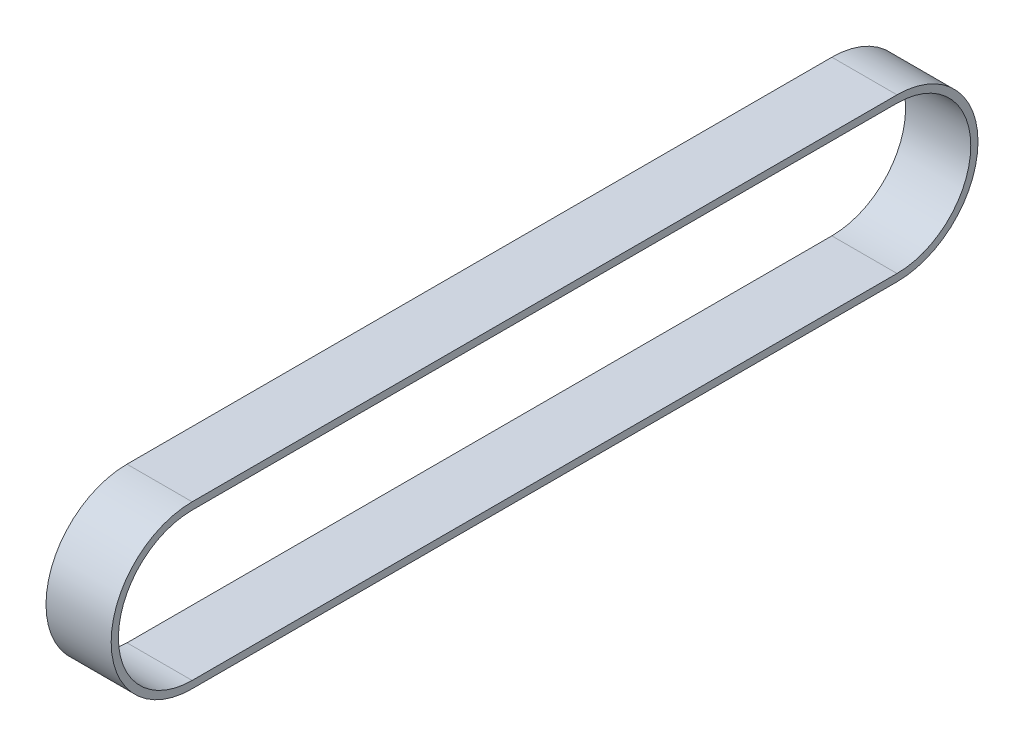
ISO-10303-21;
HEADER;
FILE_DESCRIPTION(('STEP AP214'),'2;1');
FILE_NAME('part.step','',(''),(''),'','','');
FILE_SCHEMA(('AUTOMOTIVE_DESIGN { 1 0 10303 214 1 1 1 1 }'));
ENDSEC;
DATA;
#1=APPLICATION_CONTEXT('core data for automotive mechanical design processes');
#2=APPLICATION_PROTOCOL_DEFINITION('international standard','automotive_design',2000,#1);
#3=PRODUCT_CONTEXT('',#1,'mechanical');
#4=PRODUCT('Part','Part','',(#3));
#5=PRODUCT_RELATED_PRODUCT_CATEGORY('part','',(#4));
#6=PRODUCT_DEFINITION_FORMATION('','',#4);
#7=PRODUCT_DEFINITION_CONTEXT('part definition',#1,'design');
#8=PRODUCT_DEFINITION('design','',#6,#7);
#9=PRODUCT_DEFINITION_SHAPE('','',#8);
#10=(LENGTH_UNIT() NAMED_UNIT(*) SI_UNIT(.MILLI.,.METRE.));
#11=(NAMED_UNIT(*) PLANE_ANGLE_UNIT() SI_UNIT($,.RADIAN.));
#12=(NAMED_UNIT(*) SI_UNIT($,.STERADIAN.) SOLID_ANGLE_UNIT());
#13=UNCERTAINTY_MEASURE_WITH_UNIT(LENGTH_MEASURE(1.E-05),#10,'distance_accuracy_value','');
#14=(GEOMETRIC_REPRESENTATION_CONTEXT(3) GLOBAL_UNCERTAINTY_ASSIGNED_CONTEXT((#13)) GLOBAL_UNIT_ASSIGNED_CONTEXT((#10,
#11,#12)) REPRESENTATION_CONTEXT('',''));
#15=CARTESIAN_POINT('',(0.,0.,0.));
#16=DIRECTION('',(0.,0.,1.));
#17=DIRECTION('',(1.,0.,0.));
#18=AXIS2_PLACEMENT_3D('',#15,#16,#17);
#19=CARTESIAN_POINT('',(4.5,0.,97.36128617));
#20=DIRECTION('',(1.,0.,0.));
#21=DIRECTION('',(0.,0.,-1.));
#22=AXIS2_PLACEMENT_3D('',#19,#20,#21);
#23=PLANE('',#22);
#24=CARTESIAN_POINT('',(4.5,0.,97.36128617));
#25=DIRECTION('',(1.,0.,0.));
#26=DIRECTION('',(0.,0.,-1.));
#27=AXIS2_PLACEMENT_3D('',#24,#25,#26);
#28=CIRCLE('',#27,11.185);
#29=CARTESIAN_POINT('',(4.5,11.185,97.36128617));
#30=VERTEX_POINT('',#29);
#31=CARTESIAN_POINT('',(4.5,-11.185,97.36128617));
#32=VERTEX_POINT('',#31);
#33=EDGE_CURVE('E168',#30,#32,#28,.T.);
#34=ORIENTED_EDGE('',*,*,#33,.T.);
#35=DIRECTION('',(0.,0.,-1.));
#36=VECTOR('',#35,1.);
#37=CARTESIAN_POINT('',(4.5,-11.185,0.));
#38=LINE('',#37,#36);
#39=CARTESIAN_POINT('',(4.5,-11.185,0.));
#40=VERTEX_POINT('',#39);
#41=EDGE_CURVE('E171',#32,#40,#38,.T.);
#42=ORIENTED_EDGE('',*,*,#41,.T.);
#43=CARTESIAN_POINT('',(4.5,0.,0.));
#44=DIRECTION('',(1.,0.,0.));
#45=DIRECTION('',(0.,0.,-1.));
#46=AXIS2_PLACEMENT_3D('',#43,#44,#45);
#47=CIRCLE('',#46,11.185);
#48=CARTESIAN_POINT('',(4.5,11.185,0.));
#49=VERTEX_POINT('',#48);
#50=EDGE_CURVE('E174',#40,#49,#47,.T.);
#51=ORIENTED_EDGE('',*,*,#50,.T.);
#52=DIRECTION('',(0.,0.,1.));
#53=VECTOR('',#52,1.);
#54=CARTESIAN_POINT('',(4.5,11.185,97.36128617));
#55=LINE('',#54,#53);
#56=EDGE_CURVE('E176',#49,#30,#55,.T.);
#57=ORIENTED_EDGE('',*,*,#56,.T.);
#58=EDGE_LOOP('',(#34,#42,#51,#57));
#59=FACE_BOUND('',#58,.T.);
#60=DIRECTION('',(0.,0.,-1.));
#61=VECTOR('',#60,1.);
#62=CARTESIAN_POINT('',(4.5,-10.185,0.));
#63=LINE('',#62,#61);
#64=CARTESIAN_POINT('',(4.5,-10.185,97.36128617));
#65=VERTEX_POINT('',#64);
#66=CARTESIAN_POINT('',(4.5,-10.185,0.));
#67=VERTEX_POINT('',#66);
#68=EDGE_CURVE('E140',#65,#67,#63,.T.);
#69=ORIENTED_EDGE('',*,*,#68,.F.);
#70=CARTESIAN_POINT('',(4.5,0.,97.36128617));
#71=DIRECTION('',(1.,0.,0.));
#72=DIRECTION('',(0.,0.,-1.));
#73=AXIS2_PLACEMENT_3D('',#70,#71,#72);
#74=CIRCLE('',#73,10.185);
#75=CARTESIAN_POINT('',(4.5,10.185,97.36128617));
#76=VERTEX_POINT('',#75);
#77=EDGE_CURVE('E132',#76,#65,#74,.T.);
#78=ORIENTED_EDGE('',*,*,#77,.F.);
#79=DIRECTION('',(0.,0.,1.));
#80=VECTOR('',#79,1.);
#81=CARTESIAN_POINT('',(4.5,10.185,97.36128617));
#82=LINE('',#81,#80);
#83=CARTESIAN_POINT('',(4.5,10.185,0.));
#84=VERTEX_POINT('',#83);
#85=EDGE_CURVE('E154',#84,#76,#82,.T.);
#86=ORIENTED_EDGE('',*,*,#85,.F.);
#87=CARTESIAN_POINT('',(4.5,0.,0.));
#88=DIRECTION('',(1.,0.,0.));
#89=DIRECTION('',(0.,0.,-1.));
#90=AXIS2_PLACEMENT_3D('',#87,#88,#89);
#91=CIRCLE('',#90,10.185);
#92=EDGE_CURVE('E152',#67,#84,#91,.T.);
#93=ORIENTED_EDGE('',*,*,#92,.F.);
#94=EDGE_LOOP('',(#69,#78,#86,#93));
#95=FACE_BOUND('',#94,.T.);
#96=ADVANCED_FACE('F67',(#59,#95),#23,.T.);
#97=CARTESIAN_POINT('',(-4.5,0.,97.36128617));
#98=DIRECTION('',(1.,0.,0.));
#99=DIRECTION('',(0.,0.,-1.));
#100=AXIS2_PLACEMENT_3D('',#97,#98,#99);
#101=PLANE('',#100);
#102=CARTESIAN_POINT('',(-4.5,0.,97.36128617));
#103=DIRECTION('',(1.,0.,0.));
#104=DIRECTION('',(0.,0.,-1.));
#105=AXIS2_PLACEMENT_3D('',#102,#103,#104);
#106=CIRCLE('',#105,11.185);
#107=CARTESIAN_POINT('',(-4.5,11.185,97.36128617));
#108=VERTEX_POINT('',#107);
#109=CARTESIAN_POINT('',(-4.5,-11.185,97.36128617));
#110=VERTEX_POINT('',#109);
#111=EDGE_CURVE('E148',#108,#110,#106,.T.);
#112=ORIENTED_EDGE('',*,*,#111,.F.);
#113=DIRECTION('',(0.,0.,1.));
#114=VECTOR('',#113,1.);
#115=CARTESIAN_POINT('',(-4.5,11.185,97.36128617));
#116=LINE('',#115,#114);
#117=CARTESIAN_POINT('',(-4.5,11.185,0.));
#118=VERTEX_POINT('',#117);
#119=EDGE_CURVE('E172',#118,#108,#116,.T.);
#120=ORIENTED_EDGE('',*,*,#119,.F.);
#121=CARTESIAN_POINT('',(-4.5,0.,0.));
#122=DIRECTION('',(1.,0.,0.));
#123=DIRECTION('',(0.,0.,-1.));
#124=AXIS2_PLACEMENT_3D('',#121,#122,#123);
#125=CIRCLE('',#124,11.185);
#126=CARTESIAN_POINT('',(-4.5,-11.185,0.));
#127=VERTEX_POINT('',#126);
#128=EDGE_CURVE('E183',#127,#118,#125,.T.);
#129=ORIENTED_EDGE('',*,*,#128,.F.);
#130=DIRECTION('',(0.,0.,-1.));
#131=VECTOR('',#130,1.);
#132=CARTESIAN_POINT('',(-4.5,-11.185,0.));
#133=LINE('',#132,#131);
#134=EDGE_CURVE('E181',#110,#127,#133,.T.);
#135=ORIENTED_EDGE('',*,*,#134,.F.);
#136=EDGE_LOOP('',(#112,#120,#129,#135));
#137=FACE_BOUND('',#136,.T.);
#138=CARTESIAN_POINT('',(-4.5,0.,97.36128617));
#139=DIRECTION('',(1.,0.,0.));
#140=DIRECTION('',(0.,0.,-1.));
#141=AXIS2_PLACEMENT_3D('',#138,#139,#140);
#142=CIRCLE('',#141,10.185);
#143=CARTESIAN_POINT('',(-4.5,10.185,97.36128617));
#144=VERTEX_POINT('',#143);
#145=CARTESIAN_POINT('',(-4.5,-10.185,97.36128617));
#146=VERTEX_POINT('',#145);
#147=EDGE_CURVE('E90',#144,#146,#142,.T.);
#148=ORIENTED_EDGE('',*,*,#147,.T.);
#149=DIRECTION('',(0.,0.,-1.));
#150=VECTOR('',#149,1.);
#151=CARTESIAN_POINT('',(-4.5,-10.185,0.));
#152=LINE('',#151,#150);
#153=CARTESIAN_POINT('',(-4.5,-10.185,0.));
#154=VERTEX_POINT('',#153);
#155=EDGE_CURVE('E147',#146,#154,#152,.T.);
#156=ORIENTED_EDGE('',*,*,#155,.T.);
#157=CARTESIAN_POINT('',(-4.5,0.,0.));
#158=DIRECTION('',(1.,0.,0.));
#159=DIRECTION('',(0.,0.,-1.));
#160=AXIS2_PLACEMENT_3D('',#157,#158,#159);
#161=CIRCLE('',#160,10.185);
#162=CARTESIAN_POINT('',(-4.5,10.185,0.));
#163=VERTEX_POINT('',#162);
#164=EDGE_CURVE('E160',#154,#163,#161,.T.);
#165=ORIENTED_EDGE('',*,*,#164,.T.);
#166=DIRECTION('',(0.,0.,1.));
#167=VECTOR('',#166,1.);
#168=CARTESIAN_POINT('',(-4.5,10.185,97.36128617));
#169=LINE('',#168,#167);
#170=EDGE_CURVE('E141',#163,#144,#169,.T.);
#171=ORIENTED_EDGE('',*,*,#170,.T.);
#172=EDGE_LOOP('',(#148,#156,#165,#171));
#173=FACE_BOUND('',#172,.T.);
#174=ADVANCED_FACE('F201',(#137,#173),#101,.F.);
#175=CARTESIAN_POINT('',(4.5,0.,97.36128617));
#176=DIRECTION('',(-1.,0.,0.));
#177=DIRECTION('',(0.,0.,1.));
#178=AXIS2_PLACEMENT_3D('',#175,#176,#177);
#179=CYLINDRICAL_SURFACE('',#178,11.185);
#180=ORIENTED_EDGE('',*,*,#111,.T.);
#181=DIRECTION('',(-1.,0.,0.));
#182=VECTOR('',#181,1.);
#183=CARTESIAN_POINT('',(4.5,-11.185,97.36128617));
#184=LINE('',#183,#182);
#185=EDGE_CURVE('E12',#32,#110,#184,.T.);
#186=ORIENTED_EDGE('',*,*,#185,.F.);
#187=ORIENTED_EDGE('',*,*,#33,.F.);
#188=DIRECTION('',(-1.,0.,0.));
#189=VECTOR('',#188,1.);
#190=CARTESIAN_POINT('',(4.5,11.185,97.36128617));
#191=LINE('',#190,#189);
#192=EDGE_CURVE('E178',#30,#108,#191,.T.);
#193=ORIENTED_EDGE('',*,*,#192,.T.);
#194=EDGE_LOOP('',(#180,#186,#187,#193));
#195=FACE_BOUND('',#194,.T.);
#196=ADVANCED_FACE('F69',(#195),#179,.T.);
#197=CARTESIAN_POINT('',(4.5,-11.185,0.));
#198=DIRECTION('',(0.,1.,0.));
#199=DIRECTION('',(0.,0.,1.));
#200=AXIS2_PLACEMENT_3D('',#197,#198,#199);
#201=PLANE('',#200);
#202=ORIENTED_EDGE('',*,*,#134,.T.);
#203=DIRECTION('',(-1.,0.,0.));
#204=VECTOR('',#203,1.);
#205=CARTESIAN_POINT('',(4.5,-11.185,0.));
#206=LINE('',#205,#204);
#207=EDGE_CURVE('E75',#40,#127,#206,.T.);
#208=ORIENTED_EDGE('',*,*,#207,.F.);
#209=ORIENTED_EDGE('',*,*,#41,.F.);
#210=ORIENTED_EDGE('',*,*,#185,.T.);
#211=EDGE_LOOP('',(#202,#208,#209,#210));
#212=FACE_BOUND('',#211,.T.);
#213=ADVANCED_FACE('F211',(#212),#201,.F.);
#214=CARTESIAN_POINT('',(4.5,0.,0.));
#215=DIRECTION('',(-1.,0.,0.));
#216=DIRECTION('',(0.,0.,1.));
#217=AXIS2_PLACEMENT_3D('',#214,#215,#216);
#218=CYLINDRICAL_SURFACE('',#217,11.185);
#219=ORIENTED_EDGE('',*,*,#128,.T.);
#220=DIRECTION('',(-1.,0.,0.));
#221=VECTOR('',#220,1.);
#222=CARTESIAN_POINT('',(4.5,11.185,0.));
#223=LINE('',#222,#221);
#224=EDGE_CURVE('E188',#49,#118,#223,.T.);
#225=ORIENTED_EDGE('',*,*,#224,.F.);
#226=ORIENTED_EDGE('',*,*,#50,.F.);
#227=ORIENTED_EDGE('',*,*,#207,.T.);
#228=EDGE_LOOP('',(#219,#225,#226,#227));
#229=FACE_BOUND('',#228,.T.);
#230=ADVANCED_FACE('F195',(#229),#218,.T.);
#231=CARTESIAN_POINT('',(4.5,11.185,97.36128617));
#232=DIRECTION('',(0.,-1.,0.));
#233=DIRECTION('',(0.,0.,-1.));
#234=AXIS2_PLACEMENT_3D('',#231,#232,#233);
#235=PLANE('',#234);
#236=ORIENTED_EDGE('',*,*,#119,.T.);
#237=ORIENTED_EDGE('',*,*,#192,.F.);
#238=ORIENTED_EDGE('',*,*,#56,.F.);
#239=ORIENTED_EDGE('',*,*,#224,.T.);
#240=EDGE_LOOP('',(#236,#237,#238,#239));
#241=FACE_BOUND('',#240,.T.);
#242=ADVANCED_FACE('F205',(#241),#235,.F.);
#243=CARTESIAN_POINT('',(4.5,0.,97.36128617));
#244=DIRECTION('',(-1.,0.,0.));
#245=DIRECTION('',(0.,0.,1.));
#246=AXIS2_PLACEMENT_3D('',#243,#244,#245);
#247=CYLINDRICAL_SURFACE('',#246,10.185);
#248=ORIENTED_EDGE('',*,*,#147,.F.);
#249=DIRECTION('',(-1.,0.,0.));
#250=VECTOR('',#249,1.);
#251=CARTESIAN_POINT('',(4.5,10.185,97.36128617));
#252=LINE('',#251,#250);
#253=EDGE_CURVE('E136',#76,#144,#252,.T.);
#254=ORIENTED_EDGE('',*,*,#253,.F.);
#255=ORIENTED_EDGE('',*,*,#77,.T.);
#256=DIRECTION('',(-1.,0.,0.));
#257=VECTOR('',#256,1.);
#258=CARTESIAN_POINT('',(4.5,-10.185,97.36128617));
#259=LINE('',#258,#257);
#260=EDGE_CURVE('E135',#65,#146,#259,.T.);
#261=ORIENTED_EDGE('',*,*,#260,.T.);
#262=EDGE_LOOP('',(#248,#254,#255,#261));
#263=FACE_BOUND('',#262,.T.);
#264=ADVANCED_FACE('F134',(#263),#247,.F.);
#265=CARTESIAN_POINT('',(4.5,-10.185,0.));
#266=DIRECTION('',(0.,1.,0.));
#267=DIRECTION('',(0.,0.,1.));
#268=AXIS2_PLACEMENT_3D('',#265,#266,#267);
#269=PLANE('',#268);
#270=ORIENTED_EDGE('',*,*,#155,.F.);
#271=ORIENTED_EDGE('',*,*,#260,.F.);
#272=ORIENTED_EDGE('',*,*,#68,.T.);
#273=DIRECTION('',(-1.,0.,0.));
#274=VECTOR('',#273,1.);
#275=CARTESIAN_POINT('',(4.5,-10.185,0.));
#276=LINE('',#275,#274);
#277=EDGE_CURVE('E149',#67,#154,#276,.T.);
#278=ORIENTED_EDGE('',*,*,#277,.T.);
#279=EDGE_LOOP('',(#270,#271,#272,#278));
#280=FACE_BOUND('',#279,.T.);
#281=ADVANCED_FACE('F144',(#280),#269,.T.);
#282=CARTESIAN_POINT('',(4.5,0.,0.));
#283=DIRECTION('',(-1.,0.,0.));
#284=DIRECTION('',(0.,0.,1.));
#285=AXIS2_PLACEMENT_3D('',#282,#283,#284);
#286=CYLINDRICAL_SURFACE('',#285,10.185);
#287=ORIENTED_EDGE('',*,*,#164,.F.);
#288=ORIENTED_EDGE('',*,*,#277,.F.);
#289=ORIENTED_EDGE('',*,*,#92,.T.);
#290=DIRECTION('',(-1.,0.,0.));
#291=VECTOR('',#290,1.);
#292=CARTESIAN_POINT('',(4.5,10.185,0.));
#293=LINE('',#292,#291);
#294=EDGE_CURVE('E82',#84,#163,#293,.T.);
#295=ORIENTED_EDGE('',*,*,#294,.T.);
#296=EDGE_LOOP('',(#287,#288,#289,#295));
#297=FACE_BOUND('',#296,.T.);
#298=ADVANCED_FACE('F234',(#297),#286,.F.);
#299=CARTESIAN_POINT('',(4.5,10.185,97.36128617));
#300=DIRECTION('',(0.,-1.,0.));
#301=DIRECTION('',(0.,0.,-1.));
#302=AXIS2_PLACEMENT_3D('',#299,#300,#301);
#303=PLANE('',#302);
#304=ORIENTED_EDGE('',*,*,#170,.F.);
#305=ORIENTED_EDGE('',*,*,#294,.F.);
#306=ORIENTED_EDGE('',*,*,#85,.T.);
#307=ORIENTED_EDGE('',*,*,#253,.T.);
#308=EDGE_LOOP('',(#304,#305,#306,#307));
#309=FACE_BOUND('',#308,.T.);
#310=ADVANCED_FACE('F238',(#309),#303,.T.);
#311=CLOSED_SHELL('',(#96,#174,#196,#213,#230,#242,#264,#281,#298,#310));
#312=MANIFOLD_SOLID_BREP('B2',#311);
#313=ADVANCED_BREP_SHAPE_REPRESENTATION('',(#18,#312),#14);
#314=SHAPE_DEFINITION_REPRESENTATION(#9,#313);
ENDSEC;
END-ISO-10303-21;
